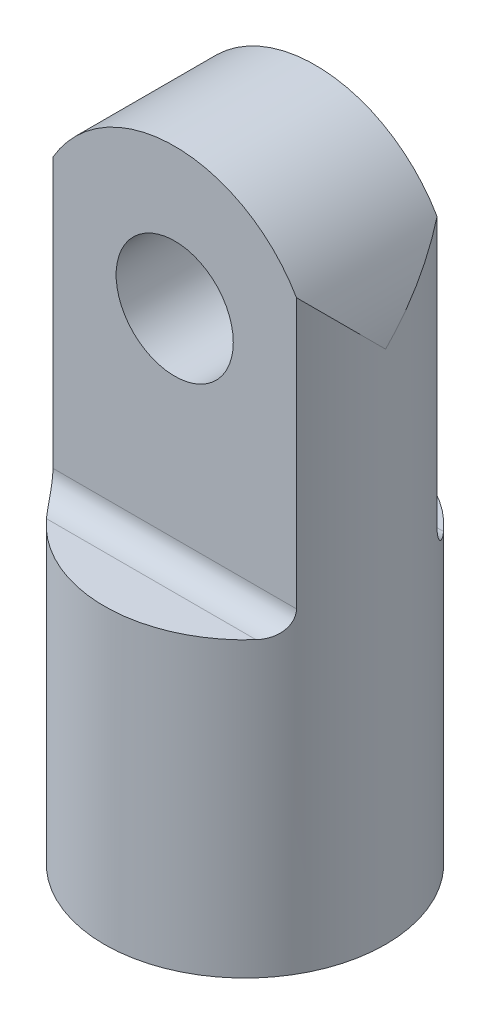
ISO-10303-21;
HEADER;
FILE_DESCRIPTION(('STEP AP214'),'2;1');
FILE_NAME('part.step','',(''),(''),'','','');
FILE_SCHEMA(('AUTOMOTIVE_DESIGN { 1 0 10303 214 1 1 1 1 }'));
ENDSEC;
DATA;
#1=APPLICATION_CONTEXT('core data for automotive mechanical design processes');
#2=APPLICATION_PROTOCOL_DEFINITION('international standard','automotive_design',2000,#1);
#3=PRODUCT_CONTEXT('',#1,'mechanical');
#4=PRODUCT('Part','Part','',(#3));
#5=PRODUCT_RELATED_PRODUCT_CATEGORY('part','',(#4));
#6=PRODUCT_DEFINITION_FORMATION('','',#4);
#7=PRODUCT_DEFINITION_CONTEXT('part definition',#1,'design');
#8=PRODUCT_DEFINITION('design','',#6,#7);
#9=PRODUCT_DEFINITION_SHAPE('','',#8);
#10=(LENGTH_UNIT() NAMED_UNIT(*) SI_UNIT(.MILLI.,.METRE.));
#11=(NAMED_UNIT(*) PLANE_ANGLE_UNIT() SI_UNIT($,.RADIAN.));
#12=(NAMED_UNIT(*) SI_UNIT($,.STERADIAN.) SOLID_ANGLE_UNIT());
#13=UNCERTAINTY_MEASURE_WITH_UNIT(LENGTH_MEASURE(1.E-05),#10,'distance_accuracy_value','');
#14=(GEOMETRIC_REPRESENTATION_CONTEXT(3) GLOBAL_UNCERTAINTY_ASSIGNED_CONTEXT((#13)) GLOBAL_UNIT_ASSIGNED_CONTEXT((#10,
#11,#12)) REPRESENTATION_CONTEXT('',''));
#15=CARTESIAN_POINT('',(0.,0.,0.));
#16=DIRECTION('',(0.,0.,1.));
#17=DIRECTION('',(1.,0.,0.));
#18=AXIS2_PLACEMENT_3D('',#15,#16,#17);
#19=CARTESIAN_POINT('',(0.,28.,0.));
#20=DIRECTION('',(0.,-1.,0.));
#21=DIRECTION('',(0.,0.,-1.));
#22=AXIS2_PLACEMENT_3D('',#19,#20,#21);
#23=CYLINDRICAL_SURFACE('',#22,6.);
#24=CARTESIAN_POINT('',(0.,0.,0.));
#25=DIRECTION('',(0.,1.,0.));
#26=DIRECTION('',(0.,0.,1.));
#27=AXIS2_PLACEMENT_3D('',#24,#25,#26);
#28=CIRCLE('',#27,6.);
#29=CARTESIAN_POINT('',(0.,0.,6.));
#30=VERTEX_POINT('',#29);
#31=EDGE_CURVE('E169',#30,#30,#28,.T.);
#32=ORIENTED_EDGE('',*,*,#31,.T.);
#33=EDGE_LOOP('',(#32));
#34=FACE_BOUND('',#33,.T.);
#35=CARTESIAN_POINT('',(0.,22.,0.));
#36=DIRECTION('',(0.,-0.707106781186547,0.707106781186547));
#37=DIRECTION('',(0.,-0.707106781186547,-0.707106781186547));
#38=AXIS2_PLACEMENT_3D('',#35,#36,#37);
#39=ELLIPSE('',#38,8.48528137423857,6.);
#40=CARTESIAN_POINT('',(5.19615242270663,25.,3.));
#41=VERTEX_POINT('',#40);
#42=CARTESIAN_POINT('',(6.,22.,0.));
#43=VERTEX_POINT('',#42);
#44=EDGE_CURVE('E94',#41,#43,#39,.F.);
#45=ORIENTED_EDGE('',*,*,#44,.F.);
#46=DIRECTION('',(0.,1.,0.));
#47=VECTOR('',#46,1.);
#48=CARTESIAN_POINT('',(5.19615242270663,12.5,3.));
#49=LINE('',#48,#47);
#50=CARTESIAN_POINT('',(5.19615242270663,13.5,3.));
#51=VERTEX_POINT('',#50);
#52=EDGE_CURVE('E136',#51,#41,#49,.T.);
#53=ORIENTED_EDGE('',*,*,#52,.F.);
#54=CARTESIAN_POINT('',(5.19615242270663,13.5,3.));
#55=CARTESIAN_POINT('',(5.1961520943003,13.4748477227849,2.99999860488349));
#56=CARTESIAN_POINT('',(5.19560422559895,13.4497082604581,3.00094970661497));
#57=CARTESIAN_POINT('',(5.19341735690131,13.3996250365905,3.00473348188604));
#58=CARTESIAN_POINT('',(5.19177861679901,13.3746812298677,3.00756570725811));
#59=CARTESIAN_POINT('',(5.1852508174372,13.3005981551172,3.01881654929635));
#60=CARTESIAN_POINT('',(5.17875006700577,13.2519831309305,3.02998979941572));
#61=CARTESIAN_POINT('',(5.16159376671621,13.1576708296917,3.05912256646104));
#62=CARTESIAN_POINT('',(5.15093995713903,13.1119723398289,3.07707924079129));
#63=CARTESIAN_POINT('',(5.12570585763981,13.0245328734735,3.11893163677724));
#64=CARTESIAN_POINT('',(5.11112319448349,12.9827943096575,3.1428309474232));
#65=CARTESIAN_POINT('',(5.07772803510433,12.9026508219176,3.19651536665069));
#66=CARTESIAN_POINT('',(5.0587773641254,12.8644297339915,3.22648766632764));
#67=CARTESIAN_POINT('',(5.01740218921968,12.7937224786209,3.29045990203086));
#68=CARTESIAN_POINT('',(4.99497807443987,12.7612356696083,3.32445938677151));
#69=CARTESIAN_POINT('',(4.94426481852067,12.6987253725108,3.39948843402626));
#70=CARTESIAN_POINT('',(4.91559613559989,12.669439745933,3.44087463476696));
#71=CARTESIAN_POINT('',(4.8550151766843,12.618156210764,3.52584300414455));
#72=CARTESIAN_POINT('',(4.8230951664603,12.5961762359215,3.56943027847086));
#73=CARTESIAN_POINT('',(4.74129704333261,12.5507488714665,3.67784628566092));
#74=CARTESIAN_POINT('',(4.68990894373948,12.5312716218733,3.74322886444043));
#75=CARTESIAN_POINT('',(4.61002826937857,12.5122500442729,3.84049681986732));
#76=CARTESIAN_POINT('',(4.58298707494761,12.5076078018418,3.87272680283525));
#77=CARTESIAN_POINT('',(4.52812349364836,12.5014892622171,3.93673311599858));
#78=CARTESIAN_POINT('',(4.500302439597,12.5000078617297,3.9685100950464));
#79=CARTESIAN_POINT('',(4.47213595499958,12.5,4.));
#80=B_SPLINE_CURVE_WITH_KNOTS('',3,(#54,#55,#56,#57,#58,#59,#60,#61,#62,#63,#64,#65,#66,#67,#68,
#69,#70,#71,#72,#73,#74,#75,#76,#77,#78,#79),.UNSPECIFIED.,.F.,.F.,(4,2,2,2,2,2,2,2,2,2,2,2,4),
(0.,0.075407788102922,0.150797617149979,0.3009140170442,0.450967580277188,0.601111987770265,
0.756889821540315,0.912650215360445,1.08671091736709,1.26119579718976,1.51588962969266,
1.64277219372698,1.76944974576947),.UNSPECIFIED.);
#81=CARTESIAN_POINT('',(4.47213595499958,12.5,4.));
#82=VERTEX_POINT('',#81);
#83=EDGE_CURVE('E101',#51,#82,#80,.T.);
#84=ORIENTED_EDGE('',*,*,#83,.T.);
#85=CARTESIAN_POINT('',(0.,12.5,0.));
#86=DIRECTION('',(0.,1.,0.));
#87=DIRECTION('',(0.,0.,1.));
#88=AXIS2_PLACEMENT_3D('',#85,#86,#87);
#89=CIRCLE('',#88,6.);
#90=CARTESIAN_POINT('',(-4.47213595499958,12.5,4.));
#91=VERTEX_POINT('',#90);
#92=EDGE_CURVE('E158',#91,#82,#89,.T.);
#93=ORIENTED_EDGE('',*,*,#92,.F.);
#94=CARTESIAN_POINT('',(-4.47213595499958,12.5,4.));
#95=CARTESIAN_POINT('',(-4.500287065788,12.5000072922515,3.96852753503432));
#96=CARTESIAN_POINT('',(-4.52809415205252,12.5014874314039,3.9367667490074));
#97=CARTESIAN_POINT('',(-4.58292768358271,12.5075997286167,3.87279669100246));
#98=CARTESIAN_POINT('',(-4.60995288878318,12.5122366351848,3.84058681508731));
#99=CARTESIAN_POINT('',(-4.68987567023699,12.5312546231458,3.74327294390211));
#100=CARTESIAN_POINT('',(-4.74131417742676,12.5507474958816,3.67782754968998));
#101=CARTESIAN_POINT('',(-4.82751407285629,12.5986387714412,3.56357032313319));
#102=CARTESIAN_POINT('',(-4.86341502486453,12.6240230118371,3.51434630846842));
#103=CARTESIAN_POINT('',(-4.93095594241443,12.6842036335209,3.41892834552691));
#104=CARTESIAN_POINT('',(-4.96260601929662,12.7189770654296,3.37272734593209));
#105=CARTESIAN_POINT('',(-5.02111082442124,12.7983505211384,3.2850048750603));
#106=CARTESIAN_POINT('',(-5.04791828609078,12.8430388094429,3.24353084979518));
#107=CARTESIAN_POINT('',(-5.09547846237367,12.9413540085326,3.16829435316249));
#108=CARTESIAN_POINT('',(-5.11623248205523,12.9949789887235,3.13453021995213));
#109=CARTESIAN_POINT('',(-5.14840942690262,13.1011441300829,3.08134845415999));
#110=CARTESIAN_POINT('',(-5.16074616770275,13.1527264222264,3.06056437868973));
#111=CARTESIAN_POINT('',(-5.18006488274101,13.2595020538004,3.02775450138099));
#112=CARTESIAN_POINT('',(-5.18705877593533,13.3146870556848,3.01570920789283));
#113=CARTESIAN_POINT('',(-5.19291140515205,13.3920393897683,3.00560774972819));
#114=CARTESIAN_POINT('',(-5.19412711892854,13.4135762620392,3.0035056549721));
#115=CARTESIAN_POINT('',(-5.19574650660453,13.4567379306043,3.00070337463296));
#116=CARTESIAN_POINT('',(-5.19615143286414,13.4783625395205,3.0000010269778));
#117=CARTESIAN_POINT('',(-5.19615242270663,13.5,3.));
#118=B_SPLINE_CURVE_WITH_KNOTS('',3,(#94,#95,#96,#97,#98,#99,#100,#101,#102,#103,#104,#105,#106,
#107,#108,#109,#110,#111,#112,#113,#114,#115,#116,#117),.UNSPECIFIED.,.F.,.F.,(4,2,2,2,2,2,2,2,
2,2,2,4),(0.,0.126611603185254,0.253414081524459,0.508383037373571,0.705644205669109,
0.902427519123534,1.10103844703568,1.29960652449676,1.46955156208863,1.63911636597784,
1.70408850679356,1.76896021256249),.UNSPECIFIED.);
#119=CARTESIAN_POINT('',(-5.19615242270663,13.5,3.));
#120=VERTEX_POINT('',#119);
#121=EDGE_CURVE('E269',#91,#120,#118,.T.);
#122=ORIENTED_EDGE('',*,*,#121,.T.);
#123=DIRECTION('',(0.,1.,0.));
#124=VECTOR('',#123,1.);
#125=CARTESIAN_POINT('',(-5.19615242270663,12.5,3.));
#126=LINE('',#125,#124);
#127=CARTESIAN_POINT('',(-5.19615242270663,25.,3.));
#128=VERTEX_POINT('',#127);
#129=EDGE_CURVE('E154',#120,#128,#126,.T.);
#130=ORIENTED_EDGE('',*,*,#129,.T.);
#131=CARTESIAN_POINT('',(0.,22.,0.));
#132=DIRECTION('',(0.,-0.707106781186547,0.707106781186547));
#133=DIRECTION('',(0.,-0.707106781186547,-0.707106781186547));
#134=AXIS2_PLACEMENT_3D('',#131,#132,#133);
#135=ELLIPSE('',#134,8.48528137423857,6.);
#136=CARTESIAN_POINT('',(-6.,22.,0.));
#137=VERTEX_POINT('',#136);
#138=EDGE_CURVE('E12',#137,#128,#135,.F.);
#139=ORIENTED_EDGE('',*,*,#138,.F.);
#140=CARTESIAN_POINT('',(0.,22.,0.));
#141=DIRECTION('',(0.,-0.707106781186547,-0.707106781186547));
#142=DIRECTION('',(0.,-0.707106781186547,0.707106781186547));
#143=AXIS2_PLACEMENT_3D('',#140,#141,#142);
#144=ELLIPSE('',#143,8.48528137423857,6.);
#145=CARTESIAN_POINT('',(-5.19615242270663,25.,-3.));
#146=VERTEX_POINT('',#145);
#147=EDGE_CURVE('E90',#146,#137,#144,.F.);
#148=ORIENTED_EDGE('',*,*,#147,.F.);
#149=DIRECTION('',(0.,1.,0.));
#150=VECTOR('',#149,1.);
#151=CARTESIAN_POINT('',(-5.19615242270663,12.5,-3.));
#152=LINE('',#151,#150);
#153=CARTESIAN_POINT('',(-5.19615242270663,13.5,-3.));
#154=VERTEX_POINT('',#153);
#155=EDGE_CURVE('E168',#154,#146,#152,.T.);
#156=ORIENTED_EDGE('',*,*,#155,.F.);
#157=CARTESIAN_POINT('',(-5.19615242270663,13.5,-3.));
#158=CARTESIAN_POINT('',(-5.1961520943003,13.4748477227849,-2.99999860488349));
#159=CARTESIAN_POINT('',(-5.19560422559895,13.4497082604581,-3.00094970661497));
#160=CARTESIAN_POINT('',(-5.19341735690131,13.3996250365905,-3.00473348188604));
#161=CARTESIAN_POINT('',(-5.19177861679901,13.3746812298677,-3.00756570725811));
#162=CARTESIAN_POINT('',(-5.1852508174372,13.3005981551172,-3.01881654929635));
#163=CARTESIAN_POINT('',(-5.17875006700577,13.2519831309305,-3.02998979941572));
#164=CARTESIAN_POINT('',(-5.16159376671621,13.1576708296917,-3.05912256646104));
#165=CARTESIAN_POINT('',(-5.15093995713903,13.1119723398289,-3.07707924079129));
#166=CARTESIAN_POINT('',(-5.12570585763981,13.0245328734735,-3.11893163677724));
#167=CARTESIAN_POINT('',(-5.11112319448349,12.9827943096575,-3.1428309474232));
#168=CARTESIAN_POINT('',(-5.07772803510433,12.9026508219176,-3.19651536665069));
#169=CARTESIAN_POINT('',(-5.0587773641254,12.8644297339915,-3.22648766632764));
#170=CARTESIAN_POINT('',(-5.01740218921968,12.7937224786209,-3.29045990203086));
#171=CARTESIAN_POINT('',(-4.99497807443987,12.7612356696083,-3.32445938677151));
#172=CARTESIAN_POINT('',(-4.94426481852067,12.6987253725108,-3.39948843402626));
#173=CARTESIAN_POINT('',(-4.91559613559989,12.669439745933,-3.44087463476696));
#174=CARTESIAN_POINT('',(-4.8550151766843,12.618156210764,-3.52584300414455));
#175=CARTESIAN_POINT('',(-4.8230951664603,12.5961762359215,-3.56943027847086));
#176=CARTESIAN_POINT('',(-4.74129704333261,12.5507488714665,-3.67784628566092));
#177=CARTESIAN_POINT('',(-4.68990894373948,12.5312716218733,-3.74322886444043));
#178=CARTESIAN_POINT('',(-4.61002826937857,12.5122500442729,-3.84049681986732));
#179=CARTESIAN_POINT('',(-4.58298707494761,12.5076078018418,-3.87272680283525));
#180=CARTESIAN_POINT('',(-4.52812349364836,12.5014892622171,-3.93673311599858));
#181=CARTESIAN_POINT('',(-4.500302439597,12.5000078617297,-3.9685100950464));
#182=CARTESIAN_POINT('',(-4.47213595499958,12.5,-4.));
#183=B_SPLINE_CURVE_WITH_KNOTS('',3,(#157,#158,#159,#160,#161,#162,#163,#164,#165,#166,#167,
#168,#169,#170,#171,#172,#173,#174,#175,#176,#177,#178,#179,#180,#181,#182),.UNSPECIFIED.,.F.,
.F.,(4,2,2,2,2,2,2,2,2,2,2,2,4),(0.,0.075407788102922,0.150797617149979,0.3009140170442,
0.450967580277188,0.601111987770265,0.756889821540315,0.912650215360445,1.08671091736709,
1.26119579718976,1.51588962969266,1.64277219372698,1.76944974576947),.UNSPECIFIED.);
#184=CARTESIAN_POINT('',(-4.47213595499958,12.5,-4.));
#185=VERTEX_POINT('',#184);
#186=EDGE_CURVE('E195',#154,#185,#183,.T.);
#187=ORIENTED_EDGE('',*,*,#186,.T.);
#188=CARTESIAN_POINT('',(0.,12.5,0.));
#189=DIRECTION('',(0.,1.,0.));
#190=DIRECTION('',(0.,0.,1.));
#191=AXIS2_PLACEMENT_3D('',#188,#189,#190);
#192=CIRCLE('',#191,6.);
#193=CARTESIAN_POINT('',(4.47213595499958,12.5,-4.));
#194=VERTEX_POINT('',#193);
#195=EDGE_CURVE('E148',#194,#185,#192,.T.);
#196=ORIENTED_EDGE('',*,*,#195,.F.);
#197=CARTESIAN_POINT('',(4.47213595499958,12.5,-4.));
#198=CARTESIAN_POINT('',(4.500287065788,12.5000072922515,-3.96852753503432));
#199=CARTESIAN_POINT('',(4.52809415205252,12.5014874314039,-3.9367667490074));
#200=CARTESIAN_POINT('',(4.58292768358271,12.5075997286167,-3.87279669100246));
#201=CARTESIAN_POINT('',(4.60995288878318,12.5122366351848,-3.84058681508731));
#202=CARTESIAN_POINT('',(4.68987567023699,12.5312546231458,-3.74327294390211));
#203=CARTESIAN_POINT('',(4.74131417742676,12.5507474958816,-3.67782754968998));
#204=CARTESIAN_POINT('',(4.82751407285629,12.5986387714412,-3.56357032313319));
#205=CARTESIAN_POINT('',(4.86341502486453,12.6240230118371,-3.51434630846842));
#206=CARTESIAN_POINT('',(4.93095594241443,12.6842036335209,-3.41892834552691));
#207=CARTESIAN_POINT('',(4.96260601929662,12.7189770654296,-3.37272734593209));
#208=CARTESIAN_POINT('',(5.02111082442124,12.7983505211384,-3.2850048750603));
#209=CARTESIAN_POINT('',(5.04791828609078,12.8430388094429,-3.24353084979518));
#210=CARTESIAN_POINT('',(5.09547846237367,12.9413540085326,-3.16829435316249));
#211=CARTESIAN_POINT('',(5.11623248205523,12.9949789887235,-3.13453021995213));
#212=CARTESIAN_POINT('',(5.14840942690262,13.1011441300829,-3.08134845415999));
#213=CARTESIAN_POINT('',(5.16074616770275,13.1527264222264,-3.06056437868973));
#214=CARTESIAN_POINT('',(5.18006488274101,13.2595020538004,-3.02775450138099));
#215=CARTESIAN_POINT('',(5.18705877593533,13.3146870556848,-3.01570920789283));
#216=CARTESIAN_POINT('',(5.19291140515205,13.3920393897683,-3.00560774972819));
#217=CARTESIAN_POINT('',(5.19412711892854,13.4135762620392,-3.0035056549721));
#218=CARTESIAN_POINT('',(5.19574650660453,13.4567379306043,-3.00070337463296));
#219=CARTESIAN_POINT('',(5.19615143286414,13.4783625395205,-3.0000010269778));
#220=CARTESIAN_POINT('',(5.19615242270663,13.5,-3.));
#221=B_SPLINE_CURVE_WITH_KNOTS('',3,(#197,#198,#199,#200,#201,#202,#203,#204,#205,#206,#207,
#208,#209,#210,#211,#212,#213,#214,#215,#216,#217,#218,#219,#220),.UNSPECIFIED.,.F.,.F.,(4,2,2,
2,2,2,2,2,2,2,2,4),(0.,0.126611603185254,0.253414081524459,0.508383037373571,0.705644205669109,
0.902427519123534,1.10103844703568,1.29960652449676,1.46955156208863,1.63911636597784,
1.70408850679356,1.76896021256249),.UNSPECIFIED.);
#222=CARTESIAN_POINT('',(5.19615242270663,13.5,-3.));
#223=VERTEX_POINT('',#222);
#224=EDGE_CURVE('E184',#194,#223,#221,.T.);
#225=ORIENTED_EDGE('',*,*,#224,.T.);
#226=DIRECTION('',(0.,1.,0.));
#227=VECTOR('',#226,1.);
#228=CARTESIAN_POINT('',(5.19615242270663,12.5,-3.));
#229=LINE('',#228,#227);
#230=CARTESIAN_POINT('',(5.19615242270663,25.,-3.));
#231=VERTEX_POINT('',#230);
#232=EDGE_CURVE('E170',#223,#231,#229,.T.);
#233=ORIENTED_EDGE('',*,*,#232,.T.);
#234=CARTESIAN_POINT('',(0.,22.,0.));
#235=DIRECTION('',(0.,-0.707106781186547,-0.707106781186547));
#236=DIRECTION('',(0.,-0.707106781186547,0.707106781186547));
#237=AXIS2_PLACEMENT_3D('',#234,#235,#236);
#238=ELLIPSE('',#237,8.48528137423857,6.);
#239=EDGE_CURVE('E139',#43,#231,#238,.F.);
#240=ORIENTED_EDGE('',*,*,#239,.F.);
#241=EDGE_LOOP('',(#45,#53,#84,#93,#122,#130,#139,#148,#156,#187,#196,#225,#233,#240));
#242=FACE_BOUND('',#241,.T.);
#243=ADVANCED_FACE('F79',(#34,#242),#23,.T.);
#244=CARTESIAN_POINT('',(0.,12.5,3.));
#245=DIRECTION('',(0.,0.,1.));
#246=DIRECTION('',(1.,0.,0.));
#247=AXIS2_PLACEMENT_3D('',#244,#245,#246);
#248=PLANE('',#247);
#249=CARTESIAN_POINT('',(0.,22.,3.));
#250=DIRECTION('',(0.,0.,1.));
#251=DIRECTION('',(1.,0.,0.));
#252=AXIS2_PLACEMENT_3D('',#249,#250,#251);
#253=CIRCLE('',#252,2.5);
#254=CARTESIAN_POINT('',(2.5,22.,3.));
#255=VERTEX_POINT('',#254);
#256=EDGE_CURVE('E142',#255,#255,#253,.T.);
#257=ORIENTED_EDGE('',*,*,#256,.F.);
#258=EDGE_LOOP('',(#257));
#259=FACE_BOUND('',#258,.T.);
#260=ORIENTED_EDGE('',*,*,#129,.F.);
#261=DIRECTION('',(1.,0.,0.));
#262=VECTOR('',#261,1.);
#263=CARTESIAN_POINT('',(5.19615242270663,13.5,3.));
#264=LINE('',#263,#262);
#265=EDGE_CURVE('E146',#120,#51,#264,.T.);
#266=ORIENTED_EDGE('',*,*,#265,.T.);
#267=ORIENTED_EDGE('',*,*,#52,.T.);
#268=CARTESIAN_POINT('',(0.,22.,3.));
#269=DIRECTION('',(0.,0.,1.));
#270=DIRECTION('',(1.,0.,0.));
#271=AXIS2_PLACEMENT_3D('',#268,#269,#270);
#272=CIRCLE('',#271,6.);
#273=EDGE_CURVE('E150',#41,#128,#272,.T.);
#274=ORIENTED_EDGE('',*,*,#273,.T.);
#275=EDGE_LOOP('',(#260,#266,#267,#274));
#276=FACE_BOUND('',#275,.T.);
#277=ADVANCED_FACE('F147',(#259,#276),#248,.T.);
#278=CARTESIAN_POINT('',(0.,12.5,-3.));
#279=DIRECTION('',(0.,0.,1.));
#280=DIRECTION('',(1.,0.,0.));
#281=AXIS2_PLACEMENT_3D('',#278,#279,#280);
#282=PLANE('',#281);
#283=CARTESIAN_POINT('',(0.,22.,-3.));
#284=DIRECTION('',(0.,0.,1.));
#285=DIRECTION('',(1.,0.,0.));
#286=AXIS2_PLACEMENT_3D('',#283,#284,#285);
#287=CIRCLE('',#286,2.5);
#288=CARTESIAN_POINT('',(2.5,22.,-3.));
#289=VERTEX_POINT('',#288);
#290=EDGE_CURVE('E160',#289,#289,#287,.T.);
#291=ORIENTED_EDGE('',*,*,#290,.T.);
#292=EDGE_LOOP('',(#291));
#293=FACE_BOUND('',#292,.T.);
#294=ORIENTED_EDGE('',*,*,#232,.F.);
#295=DIRECTION('',(1.,0.,0.));
#296=VECTOR('',#295,1.);
#297=CARTESIAN_POINT('',(0.,13.5,-3.));
#298=LINE('',#297,#296);
#299=EDGE_CURVE('E179',#223,#154,#298,.F.);
#300=ORIENTED_EDGE('',*,*,#299,.T.);
#301=ORIENTED_EDGE('',*,*,#155,.T.);
#302=CARTESIAN_POINT('',(0.,22.,-3.));
#303=DIRECTION('',(0.,0.,1.));
#304=DIRECTION('',(1.,0.,0.));
#305=AXIS2_PLACEMENT_3D('',#302,#303,#304);
#306=CIRCLE('',#305,6.);
#307=EDGE_CURVE('E174',#231,#146,#306,.T.);
#308=ORIENTED_EDGE('',*,*,#307,.F.);
#309=EDGE_LOOP('',(#294,#300,#301,#308));
#310=FACE_BOUND('',#309,.T.);
#311=ADVANCED_FACE('F223',(#293,#310),#282,.F.);
#312=CARTESIAN_POINT('',(0.,0.,0.));
#313=DIRECTION('',(0.,1.,0.));
#314=DIRECTION('',(0.,0.,1.));
#315=AXIS2_PLACEMENT_3D('',#312,#313,#314);
#316=PLANE('',#315);
#317=CARTESIAN_POINT('',(0.,0.,0.));
#318=DIRECTION('',(0.,-1.,0.));
#319=DIRECTION('',(0.,0.,-1.));
#320=AXIS2_PLACEMENT_3D('',#317,#318,#319);
#321=CIRCLE('',#320,2.5);
#322=CARTESIAN_POINT('',(0.,0.,-2.5));
#323=VERTEX_POINT('',#322);
#324=EDGE_CURVE('E257',#323,#323,#321,.T.);
#325=ORIENTED_EDGE('',*,*,#324,.F.);
#326=EDGE_LOOP('',(#325));
#327=FACE_BOUND('',#326,.T.);
#328=ORIENTED_EDGE('',*,*,#31,.F.);
#329=EDGE_LOOP('',(#328));
#330=FACE_BOUND('',#329,.T.);
#331=ADVANCED_FACE('F228',(#327,#330),#316,.F.);
#332=CARTESIAN_POINT('',(0.,12.5,0.));
#333=DIRECTION('',(0.,1.,0.));
#334=DIRECTION('',(0.,0.,1.));
#335=AXIS2_PLACEMENT_3D('',#332,#333,#334);
#336=PLANE('',#335);
#337=ORIENTED_EDGE('',*,*,#92,.T.);
#338=DIRECTION('',(1.,0.,0.));
#339=VECTOR('',#338,1.);
#340=CARTESIAN_POINT('',(-5.19615242270663,12.5,4.));
#341=LINE('',#340,#339);
#342=EDGE_CURVE('E182',#82,#91,#341,.F.);
#343=ORIENTED_EDGE('',*,*,#342,.T.);
#344=EDGE_LOOP('',(#337,#343));
#345=FACE_BOUND('',#344,.T.);
#346=ADVANCED_FACE('F226',(#345),#336,.T.);
#347=CARTESIAN_POINT('',(0.,12.5,0.));
#348=DIRECTION('',(0.,1.,0.));
#349=DIRECTION('',(0.,0.,1.));
#350=AXIS2_PLACEMENT_3D('',#347,#348,#349);
#351=PLANE('',#350);
#352=ORIENTED_EDGE('',*,*,#195,.T.);
#353=DIRECTION('',(1.,0.,0.));
#354=VECTOR('',#353,1.);
#355=CARTESIAN_POINT('',(0.,12.5,-4.));
#356=LINE('',#355,#354);
#357=EDGE_CURVE('E176',#185,#194,#356,.T.);
#358=ORIENTED_EDGE('',*,*,#357,.T.);
#359=EDGE_LOOP('',(#352,#358));
#360=FACE_BOUND('',#359,.T.);
#361=ADVANCED_FACE('F232',(#360),#351,.T.);
#362=CARTESIAN_POINT('',(0.,22.,-6.));
#363=DIRECTION('',(0.,0.,1.));
#364=DIRECTION('',(1.,0.,0.));
#365=AXIS2_PLACEMENT_3D('',#362,#363,#364);
#366=CYLINDRICAL_SURFACE('',#365,6.);
#367=ORIENTED_EDGE('',*,*,#138,.T.);
#368=ORIENTED_EDGE('',*,*,#273,.F.);
#369=ORIENTED_EDGE('',*,*,#44,.T.);
#370=ORIENTED_EDGE('',*,*,#239,.T.);
#371=ORIENTED_EDGE('',*,*,#307,.T.);
#372=ORIENTED_EDGE('',*,*,#147,.T.);
#373=EDGE_LOOP('',(#367,#368,#369,#370,#371,#372));
#374=FACE_BOUND('',#373,.T.);
#375=ADVANCED_FACE('F155',(#374),#366,.T.);
#376=CARTESIAN_POINT('',(0.,22.,-6.));
#377=DIRECTION('',(0.,0.,1.));
#378=DIRECTION('',(1.,0.,0.));
#379=AXIS2_PLACEMENT_3D('',#376,#377,#378);
#380=CYLINDRICAL_SURFACE('',#379,2.5);
#381=ORIENTED_EDGE('',*,*,#256,.T.);
#382=EDGE_LOOP('',(#381));
#383=FACE_BOUND('',#382,.T.);
#384=ORIENTED_EDGE('',*,*,#290,.F.);
#385=EDGE_LOOP('',(#384));
#386=FACE_BOUND('',#385,.T.);
#387=ADVANCED_FACE('F201',(#383,#386),#380,.F.);
#388=CARTESIAN_POINT('',(0.,13.5,-4.));
#389=DIRECTION('',(1.,0.,0.));
#390=DIRECTION('',(0.,0.,-1.));
#391=AXIS2_PLACEMENT_3D('',#388,#389,#390);
#392=CYLINDRICAL_SURFACE('',#391,1.);
#393=ORIENTED_EDGE('',*,*,#186,.F.);
#394=ORIENTED_EDGE('',*,*,#299,.F.);
#395=ORIENTED_EDGE('',*,*,#224,.F.);
#396=ORIENTED_EDGE('',*,*,#357,.F.);
#397=EDGE_LOOP('',(#393,#394,#395,#396));
#398=FACE_BOUND('',#397,.T.);
#399=ADVANCED_FACE('F197',(#398),#392,.F.);
#400=CARTESIAN_POINT('',(0.,13.5,4.));
#401=DIRECTION('',(-1.,0.,0.));
#402=DIRECTION('',(0.,0.,1.));
#403=AXIS2_PLACEMENT_3D('',#400,#401,#402);
#404=CYLINDRICAL_SURFACE('',#403,1.);
#405=ORIENTED_EDGE('',*,*,#121,.F.);
#406=ORIENTED_EDGE('',*,*,#342,.F.);
#407=ORIENTED_EDGE('',*,*,#83,.F.);
#408=ORIENTED_EDGE('',*,*,#265,.F.);
#409=EDGE_LOOP('',(#405,#406,#407,#408));
#410=FACE_BOUND('',#409,.T.);
#411=ADVANCED_FACE('F82',(#410),#404,.F.);
#412=CARTESIAN_POINT('',(0.,10.,0.));
#413=DIRECTION('',(0.,-1.,0.));
#414=DIRECTION('',(0.,0.,-1.));
#415=AXIS2_PLACEMENT_3D('',#412,#413,#414);
#416=CYLINDRICAL_SURFACE('',#415,2.5);
#417=CARTESIAN_POINT('',(0.,10.,0.));
#418=DIRECTION('',(0.,-1.,0.));
#419=DIRECTION('',(0.,0.,-1.));
#420=AXIS2_PLACEMENT_3D('',#417,#418,#419);
#421=CIRCLE('',#420,2.5);
#422=CARTESIAN_POINT('',(0.,10.,-2.5));
#423=VERTEX_POINT('',#422);
#424=EDGE_CURVE('E253',#423,#423,#421,.T.);
#425=ORIENTED_EDGE('',*,*,#424,.F.);
#426=EDGE_LOOP('',(#425));
#427=FACE_BOUND('',#426,.T.);
#428=ORIENTED_EDGE('',*,*,#324,.T.);
#429=EDGE_LOOP('',(#428));
#430=FACE_BOUND('',#429,.T.);
#431=ADVANCED_FACE('F208',(#427,#430),#416,.F.);
#432=CARTESIAN_POINT('',(0.,10.,0.));
#433=DIRECTION('',(0.,-1.,0.));
#434=DIRECTION('',(0.,0.,-1.));
#435=AXIS2_PLACEMENT_3D('',#432,#433,#434);
#436=PLANE('',#435);
#437=ORIENTED_EDGE('',*,*,#424,.T.);
#438=EDGE_LOOP('',(#437));
#439=FACE_BOUND('',#438,.T.);
#440=ADVANCED_FACE('F250',(#439),#436,.T.);
#441=CLOSED_SHELL('',(#243,#277,#311,#331,#346,#361,#375,#387,#399,#411,#431,#440));
#442=MANIFOLD_SOLID_BREP('B2',#441);
#443=ADVANCED_BREP_SHAPE_REPRESENTATION('',(#18,#442),#14);
#444=SHAPE_DEFINITION_REPRESENTATION(#9,#443);
ENDSEC;
END-ISO-10303-21;
